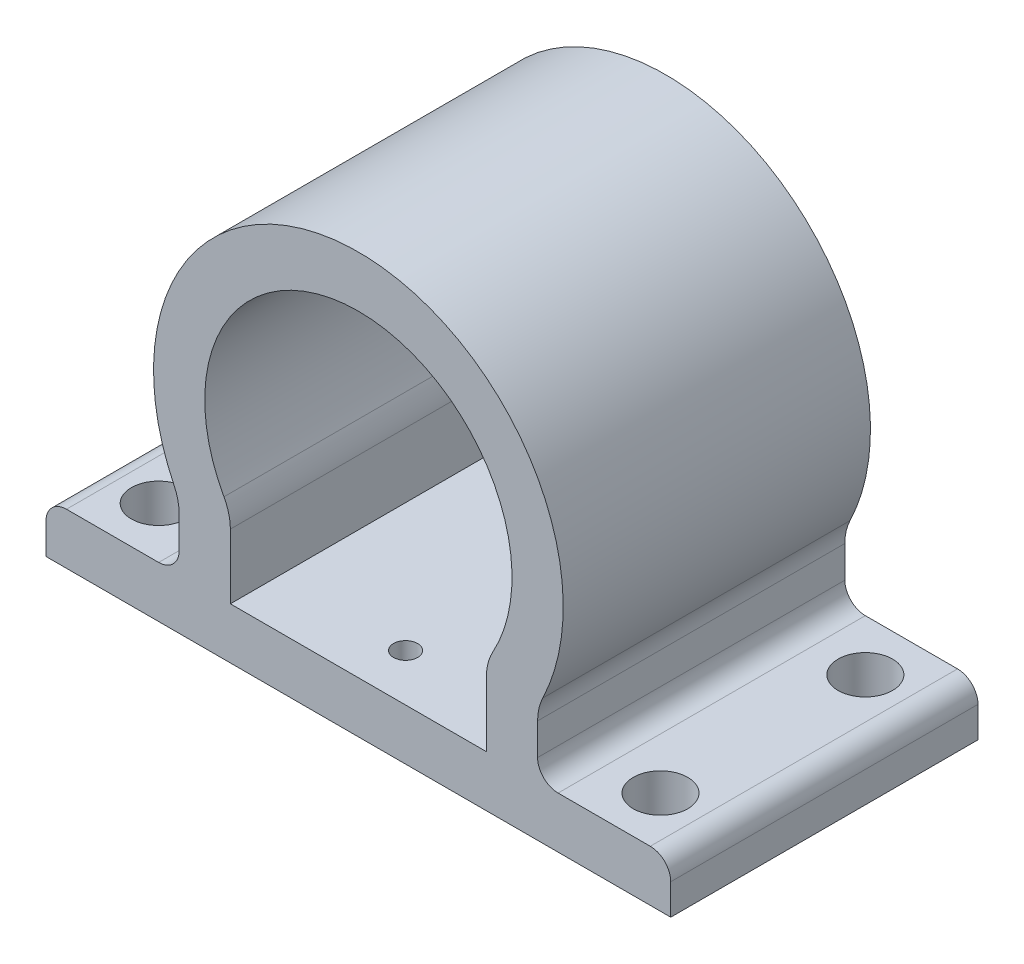
ISO-10303-21;
HEADER;
FILE_DESCRIPTION(('STEP AP214'),'2;1');
FILE_NAME('part.step','',(''),(''),'','','');
FILE_SCHEMA(('AUTOMOTIVE_DESIGN { 1 0 10303 214 1 1 1 1 }'));
ENDSEC;
DATA;
#1=APPLICATION_CONTEXT('core data for automotive mechanical design processes');
#2=APPLICATION_PROTOCOL_DEFINITION('international standard','automotive_design',2000,#1);
#3=PRODUCT_CONTEXT('',#1,'mechanical');
#4=PRODUCT('Part','Part','',(#3));
#5=PRODUCT_RELATED_PRODUCT_CATEGORY('part','',(#4));
#6=PRODUCT_DEFINITION_FORMATION('','',#4);
#7=PRODUCT_DEFINITION_CONTEXT('part definition',#1,'design');
#8=PRODUCT_DEFINITION('design','',#6,#7);
#9=PRODUCT_DEFINITION_SHAPE('','',#8);
#10=(LENGTH_UNIT() NAMED_UNIT(*) SI_UNIT(.MILLI.,.METRE.));
#11=(NAMED_UNIT(*) PLANE_ANGLE_UNIT() SI_UNIT($,.RADIAN.));
#12=(NAMED_UNIT(*) SI_UNIT($,.STERADIAN.) SOLID_ANGLE_UNIT());
#13=UNCERTAINTY_MEASURE_WITH_UNIT(LENGTH_MEASURE(1.E-05),#10,'distance_accuracy_value','');
#14=(GEOMETRIC_REPRESENTATION_CONTEXT(3) GLOBAL_UNCERTAINTY_ASSIGNED_CONTEXT((#13)) GLOBAL_UNIT_ASSIGNED_CONTEXT((#10,
#11,#12)) REPRESENTATION_CONTEXT('',''));
#15=CARTESIAN_POINT('',(0.,0.,0.));
#16=DIRECTION('',(0.,0.,1.));
#17=DIRECTION('',(1.,0.,0.));
#18=AXIS2_PLACEMENT_3D('',#15,#16,#17);
#19=CARTESIAN_POINT('',(0.,-20.32,32.2471478));
#20=DIRECTION('',(0.,-1.,0.));
#21=DIRECTION('',(0.,0.,-1.));
#22=AXIS2_PLACEMENT_3D('',#19,#20,#21);
#23=CYLINDRICAL_SURFACE('',#22,3.);
#24=CARTESIAN_POINT('',(0.,-26.67,32.2471478));
#25=DIRECTION('',(0.,-1.,0.));
#26=DIRECTION('',(0.,0.,-1.));
#27=AXIS2_PLACEMENT_3D('',#24,#25,#26);
#28=CIRCLE('',#27,3.);
#29=CARTESIAN_POINT('',(0.,-26.67,29.2471478));
#30=VERTEX_POINT('',#29);
#31=EDGE_CURVE('E231',#30,#30,#28,.T.);
#32=ORIENTED_EDGE('',*,*,#31,.T.);
#33=EDGE_LOOP('',(#32));
#34=FACE_BOUND('',#33,.T.);
#35=CARTESIAN_POINT('',(0.,-22.86,32.2471478));
#36=DIRECTION('',(0.,1.,0.));
#37=DIRECTION('',(0.,0.,1.));
#38=AXIS2_PLACEMENT_3D('',#35,#36,#37);
#39=CIRCLE('',#38,3.);
#40=CARTESIAN_POINT('',(0.,-22.86,35.2471478));
#41=VERTEX_POINT('',#40);
#42=EDGE_CURVE('E11',#41,#41,#39,.F.);
#43=ORIENTED_EDGE('',*,*,#42,.F.);
#44=EDGE_LOOP('',(#43));
#45=FACE_BOUND('',#44,.T.);
#46=ADVANCED_FACE('F39',(#34,#45),#23,.F.);
#47=CARTESIAN_POINT('',(0.,-20.32,13.2471478));
#48=DIRECTION('',(0.,-1.,0.));
#49=DIRECTION('',(0.,0.,-1.));
#50=AXIS2_PLACEMENT_3D('',#47,#48,#49);
#51=CYLINDRICAL_SURFACE('',#50,3.);
#52=CARTESIAN_POINT('',(0.,-26.67,13.2471478));
#53=DIRECTION('',(0.,-1.,0.));
#54=DIRECTION('',(0.,0.,-1.));
#55=AXIS2_PLACEMENT_3D('',#52,#53,#54);
#56=CIRCLE('',#55,3.);
#57=CARTESIAN_POINT('',(0.,-26.67,10.2471478));
#58=VERTEX_POINT('',#57);
#59=EDGE_CURVE('E230',#58,#58,#56,.T.);
#60=ORIENTED_EDGE('',*,*,#59,.T.);
#61=EDGE_LOOP('',(#60));
#62=FACE_BOUND('',#61,.T.);
#63=CARTESIAN_POINT('',(0.,-22.86,13.2471478));
#64=DIRECTION('',(0.,1.,0.));
#65=DIRECTION('',(0.,0.,1.));
#66=AXIS2_PLACEMENT_3D('',#63,#64,#65);
#67=CIRCLE('',#66,3.);
#68=CARTESIAN_POINT('',(0.,-22.86,16.2471478));
#69=VERTEX_POINT('',#68);
#70=EDGE_CURVE('E47',#69,#69,#67,.F.);
#71=ORIENTED_EDGE('',*,*,#70,.F.);
#72=EDGE_LOOP('',(#71));
#73=FACE_BOUND('',#72,.T.);
#74=ADVANCED_FACE('F362',(#62,#73),#51,.F.);
#75=CARTESIAN_POINT('',(-22.225,-26.67,38.1));
#76=DIRECTION('',(1.,0.,0.));
#77=DIRECTION('',(0.,0.,-1.));
#78=AXIS2_PLACEMENT_3D('',#75,#76,#77);
#79=PLANE('',#78);
#80=DIRECTION('',(0.,-1.,0.));
#81=VECTOR('',#80,1.);
#82=CARTESIAN_POINT('',(-22.225,-26.67,0.));
#83=LINE('',#82,#81);
#84=CARTESIAN_POINT('',(-22.225,-13.8395041457417,0.));
#85=VERTEX_POINT('',#84);
#86=CARTESIAN_POINT('',(-22.225,-17.78,0.));
#87=VERTEX_POINT('',#86);
#88=EDGE_CURVE('E272',#85,#87,#83,.T.);
#89=ORIENTED_EDGE('',*,*,#88,.T.);
#90=DIRECTION('',(0.,0.,-1.));
#91=VECTOR('',#90,1.);
#92=CARTESIAN_POINT('',(-22.225,-17.78,38.1));
#93=LINE('',#92,#91);
#94=CARTESIAN_POINT('',(-22.225,-17.78,38.1));
#95=VERTEX_POINT('',#94);
#96=EDGE_CURVE('E346',#87,#95,#93,.F.);
#97=ORIENTED_EDGE('',*,*,#96,.T.);
#98=DIRECTION('',(0.,-1.,0.));
#99=VECTOR('',#98,1.);
#100=CARTESIAN_POINT('',(-22.225,-26.67,38.1));
#101=LINE('',#100,#99);
#102=CARTESIAN_POINT('',(-22.225,-13.8395041457417,38.1));
#103=VERTEX_POINT('',#102);
#104=EDGE_CURVE('E188',#103,#95,#101,.T.);
#105=ORIENTED_EDGE('',*,*,#104,.F.);
#106=DIRECTION('',(0.,0.,1.));
#107=VECTOR('',#106,1.);
#108=CARTESIAN_POINT('',(-22.225,-13.8395041457417,0.));
#109=LINE('',#108,#107);
#110=EDGE_CURVE('E300',#103,#85,#109,.F.);
#111=ORIENTED_EDGE('',*,*,#110,.T.);
#112=EDGE_LOOP('',(#89,#97,#105,#111));
#113=FACE_BOUND('',#112,.T.);
#114=ADVANCED_FACE('F364',(#113),#79,.F.);
#115=CARTESIAN_POINT('',(0.,0.,38.1));
#116=DIRECTION('',(0.,0.,-1.));
#117=DIRECTION('',(-1.,0.,0.));
#118=AXIS2_PLACEMENT_3D('',#115,#116,#117);
#119=PLANE('',#118);
#120=DIRECTION('',(0.,1.,0.));
#121=VECTOR('',#120,1.);
#122=CARTESIAN_POINT('',(38.735,-20.32,38.1));
#123=LINE('',#122,#121);
#124=CARTESIAN_POINT('',(38.735,-26.67,38.1));
#125=VERTEX_POINT('',#124);
#126=CARTESIAN_POINT('',(38.735,-22.86,38.1));
#127=VERTEX_POINT('',#126);
#128=EDGE_CURVE('E180',#125,#127,#123,.T.);
#129=ORIENTED_EDGE('',*,*,#128,.T.);
#130=CARTESIAN_POINT('',(36.195,-22.86,38.1));
#131=DIRECTION('',(0.,0.,-1.));
#132=DIRECTION('',(-1.,0.,0.));
#133=AXIS2_PLACEMENT_3D('',#130,#131,#132);
#134=CIRCLE('',#133,2.54);
#135=CARTESIAN_POINT('',(36.195,-20.32,38.1));
#136=VERTEX_POINT('',#135);
#137=EDGE_CURVE('E336',#127,#136,#134,.F.);
#138=ORIENTED_EDGE('',*,*,#137,.T.);
#139=DIRECTION('',(-1.,0.,0.));
#140=VECTOR('',#139,1.);
#141=CARTESIAN_POINT('',(38.735,-20.32,38.1));
#142=LINE('',#141,#140);
#143=CARTESIAN_POINT('',(24.765,-20.32,38.1));
#144=VERTEX_POINT('',#143);
#145=EDGE_CURVE('E203',#136,#144,#142,.T.);
#146=ORIENTED_EDGE('',*,*,#145,.T.);
#147=CARTESIAN_POINT('',(24.765,-17.78,38.1));
#148=DIRECTION('',(0.,0.,-1.));
#149=DIRECTION('',(-1.,0.,0.));
#150=AXIS2_PLACEMENT_3D('',#147,#148,#149);
#151=CIRCLE('',#150,2.54);
#152=CARTESIAN_POINT('',(22.225,-17.78,38.1));
#153=VERTEX_POINT('',#152);
#154=EDGE_CURVE('E353',#144,#153,#151,.T.);
#155=ORIENTED_EDGE('',*,*,#154,.T.);
#156=DIRECTION('',(0.,1.,0.));
#157=VECTOR('',#156,1.);
#158=CARTESIAN_POINT('',(22.225,-26.67,38.1));
#159=LINE('',#158,#157);
#160=CARTESIAN_POINT('',(22.225,-13.8395041457417,38.1));
#161=VERTEX_POINT('',#160);
#162=EDGE_CURVE('E187',#153,#161,#159,.T.);
#163=ORIENTED_EDGE('',*,*,#162,.T.);
#164=CARTESIAN_POINT('',(28.575,-13.8395041457417,38.1));
#165=DIRECTION('',(0.,0.,-1.));
#166=DIRECTION('',(-1.,0.,0.));
#167=AXIS2_PLACEMENT_3D('',#164,#165,#166);
#168=CIRCLE('',#167,6.35);
#169=CARTESIAN_POINT('',(22.86,-11.0716033165933,38.1));
#170=VERTEX_POINT('',#169);
#171=EDGE_CURVE('E308',#161,#170,#168,.T.);
#172=ORIENTED_EDGE('',*,*,#171,.T.);
#173=CARTESIAN_POINT('',(0.,0.,38.1));
#174=DIRECTION('',(0.,0.,1.));
#175=DIRECTION('',(-1.,0.,0.));
#176=AXIS2_PLACEMENT_3D('',#173,#174,#175);
#177=CIRCLE('',#176,25.4);
#178=CARTESIAN_POINT('',(-22.86,-11.0716033165933,38.1));
#179=VERTEX_POINT('',#178);
#180=EDGE_CURVE('E263',#170,#179,#177,.T.);
#181=ORIENTED_EDGE('',*,*,#180,.T.);
#182=CARTESIAN_POINT('',(-28.575,-13.8395041457417,38.1));
#183=DIRECTION('',(0.,0.,-1.));
#184=DIRECTION('',(-1.,0.,0.));
#185=AXIS2_PLACEMENT_3D('',#182,#183,#184);
#186=CIRCLE('',#185,6.35);
#187=EDGE_CURVE('E312',#179,#103,#186,.T.);
#188=ORIENTED_EDGE('',*,*,#187,.T.);
#189=ORIENTED_EDGE('',*,*,#104,.T.);
#190=CARTESIAN_POINT('',(-24.765,-17.78,38.1));
#191=DIRECTION('',(0.,0.,-1.));
#192=DIRECTION('',(-1.,0.,0.));
#193=AXIS2_PLACEMENT_3D('',#190,#191,#192);
#194=CIRCLE('',#193,2.54);
#195=CARTESIAN_POINT('',(-24.765,-20.32,38.1));
#196=VERTEX_POINT('',#195);
#197=EDGE_CURVE('E60',#95,#196,#194,.T.);
#198=ORIENTED_EDGE('',*,*,#197,.T.);
#199=DIRECTION('',(1.,0.,0.));
#200=VECTOR('',#199,1.);
#201=CARTESIAN_POINT('',(-38.735,-20.32,38.1));
#202=LINE('',#201,#200);
#203=CARTESIAN_POINT('',(-36.195,-20.32,38.1));
#204=VERTEX_POINT('',#203);
#205=EDGE_CURVE('E228',#204,#196,#202,.T.);
#206=ORIENTED_EDGE('',*,*,#205,.F.);
#207=CARTESIAN_POINT('',(-36.195,-22.86,38.1));
#208=DIRECTION('',(0.,0.,-1.));
#209=DIRECTION('',(-1.,0.,0.));
#210=AXIS2_PLACEMENT_3D('',#207,#208,#209);
#211=CIRCLE('',#210,2.54);
#212=CARTESIAN_POINT('',(-38.735,-22.86,38.1));
#213=VERTEX_POINT('',#212);
#214=EDGE_CURVE('E54',#204,#213,#211,.F.);
#215=ORIENTED_EDGE('',*,*,#214,.T.);
#216=DIRECTION('',(0.,1.,0.));
#217=VECTOR('',#216,1.);
#218=CARTESIAN_POINT('',(-38.735,-20.32,38.1));
#219=LINE('',#218,#217);
#220=CARTESIAN_POINT('',(-38.735,-26.67,38.1));
#221=VERTEX_POINT('',#220);
#222=EDGE_CURVE('E182',#221,#213,#219,.T.);
#223=ORIENTED_EDGE('',*,*,#222,.F.);
#224=DIRECTION('',(1.,0.,0.));
#225=VECTOR('',#224,1.);
#226=CARTESIAN_POINT('',(-22.225,-26.67,38.1));
#227=LINE('',#226,#225);
#228=EDGE_CURVE('E176',#221,#125,#227,.T.);
#229=ORIENTED_EDGE('',*,*,#228,.T.);
#230=EDGE_LOOP('',(#129,#138,#146,#155,#163,#172,#181,#188,#189,#198,#206,#215,#223,#229));
#231=FACE_BOUND('',#230,.T.);
#232=CARTESIAN_POINT('',(0.,0.,38.1));
#233=DIRECTION('',(0.,0.,1.));
#234=DIRECTION('',(-1.,0.,0.));
#235=AXIS2_PLACEMENT_3D('',#232,#233,#234);
#236=CIRCLE('',#235,19.05);
#237=CARTESIAN_POINT('',(16.66875,-9.22254159315642,38.1));
#238=VERTEX_POINT('',#237);
#239=CARTESIAN_POINT('',(-16.66875,-9.22254159315642,38.1));
#240=VERTEX_POINT('',#239);
#241=EDGE_CURVE('E245',#238,#240,#236,.T.);
#242=ORIENTED_EDGE('',*,*,#241,.F.);
#243=CARTESIAN_POINT('',(22.225,-12.2967221242086,38.1));
#244=DIRECTION('',(0.,0.,-1.));
#245=DIRECTION('',(-1.,0.,0.));
#246=AXIS2_PLACEMENT_3D('',#243,#244,#245);
#247=CIRCLE('',#246,6.35);
#248=CARTESIAN_POINT('',(15.875,-12.2967221242086,38.1));
#249=VERTEX_POINT('',#248);
#250=EDGE_CURVE('E298',#238,#249,#247,.F.);
#251=ORIENTED_EDGE('',*,*,#250,.T.);
#252=DIRECTION('',(0.,1.,0.));
#253=VECTOR('',#252,1.);
#254=CARTESIAN_POINT('',(15.875,-20.32,38.1));
#255=LINE('',#254,#253);
#256=CARTESIAN_POINT('',(15.875,-20.32,38.1));
#257=VERTEX_POINT('',#256);
#258=EDGE_CURVE('E242',#257,#249,#255,.T.);
#259=ORIENTED_EDGE('',*,*,#258,.F.);
#260=DIRECTION('',(1.,0.,0.));
#261=VECTOR('',#260,1.);
#262=CARTESIAN_POINT('',(-15.875,-20.32,38.1));
#263=LINE('',#262,#261);
#264=CARTESIAN_POINT('',(-15.875,-20.32,38.1));
#265=VERTEX_POINT('',#264);
#266=EDGE_CURVE('E239',#265,#257,#263,.T.);
#267=ORIENTED_EDGE('',*,*,#266,.F.);
#268=DIRECTION('',(0.,-1.,0.));
#269=VECTOR('',#268,1.);
#270=CARTESIAN_POINT('',(-15.875,-20.32,38.1));
#271=LINE('',#270,#269);
#272=CARTESIAN_POINT('',(-15.875,-12.2967221242086,38.1));
#273=VERTEX_POINT('',#272);
#274=EDGE_CURVE('E237',#273,#265,#271,.T.);
#275=ORIENTED_EDGE('',*,*,#274,.F.);
#276=CARTESIAN_POINT('',(-22.225,-12.2967221242086,38.1));
#277=DIRECTION('',(0.,0.,-1.));
#278=DIRECTION('',(-1.,0.,0.));
#279=AXIS2_PLACEMENT_3D('',#276,#277,#278);
#280=CIRCLE('',#279,6.35);
#281=EDGE_CURVE('E296',#273,#240,#280,.F.);
#282=ORIENTED_EDGE('',*,*,#281,.T.);
#283=EDGE_LOOP('',(#242,#251,#259,#267,#275,#282));
#284=FACE_BOUND('',#283,.T.);
#285=ADVANCED_FACE('F178',(#231,#284),#119,.F.);
#286=CARTESIAN_POINT('',(0.,0.,0.));
#287=DIRECTION('',(0.,0.,-1.));
#288=DIRECTION('',(-1.,0.,0.));
#289=AXIS2_PLACEMENT_3D('',#286,#287,#288);
#290=PLANE('',#289);
#291=DIRECTION('',(-1.,0.,0.));
#292=VECTOR('',#291,1.);
#293=CARTESIAN_POINT('',(38.735,-20.32,0.));
#294=LINE('',#293,#292);
#295=CARTESIAN_POINT('',(36.195,-20.32,0.));
#296=VERTEX_POINT('',#295);
#297=CARTESIAN_POINT('',(24.765,-20.32,0.));
#298=VERTEX_POINT('',#297);
#299=EDGE_CURVE('E206',#296,#298,#294,.T.);
#300=ORIENTED_EDGE('',*,*,#299,.F.);
#301=CARTESIAN_POINT('',(36.195,-22.86,0.));
#302=DIRECTION('',(0.,0.,-1.));
#303=DIRECTION('',(-1.,0.,0.));
#304=AXIS2_PLACEMENT_3D('',#301,#302,#303);
#305=CIRCLE('',#304,2.54);
#306=CARTESIAN_POINT('',(38.735,-22.86,0.));
#307=VERTEX_POINT('',#306);
#308=EDGE_CURVE('E332',#296,#307,#305,.T.);
#309=ORIENTED_EDGE('',*,*,#308,.T.);
#310=DIRECTION('',(0.,-1.,0.));
#311=VECTOR('',#310,1.);
#312=CARTESIAN_POINT('',(38.735,-20.32,0.));
#313=LINE('',#312,#311);
#314=CARTESIAN_POINT('',(38.735,-26.67,0.));
#315=VERTEX_POINT('',#314);
#316=EDGE_CURVE('E197',#307,#315,#313,.T.);
#317=ORIENTED_EDGE('',*,*,#316,.T.);
#318=DIRECTION('',(1.,0.,0.));
#319=VECTOR('',#318,1.);
#320=CARTESIAN_POINT('',(-22.225,-26.67,0.));
#321=LINE('',#320,#319);
#322=CARTESIAN_POINT('',(-38.735,-26.67,0.));
#323=VERTEX_POINT('',#322);
#324=EDGE_CURVE('E202',#323,#315,#321,.T.);
#325=ORIENTED_EDGE('',*,*,#324,.F.);
#326=DIRECTION('',(0.,-1.,0.));
#327=VECTOR('',#326,1.);
#328=CARTESIAN_POINT('',(-38.735,-20.32,0.));
#329=LINE('',#328,#327);
#330=CARTESIAN_POINT('',(-38.735,-22.86,0.));
#331=VERTEX_POINT('',#330);
#332=EDGE_CURVE('E219',#331,#323,#329,.T.);
#333=ORIENTED_EDGE('',*,*,#332,.F.);
#334=CARTESIAN_POINT('',(-36.195,-22.86,0.));
#335=DIRECTION('',(0.,0.,-1.));
#336=DIRECTION('',(-1.,0.,0.));
#337=AXIS2_PLACEMENT_3D('',#334,#335,#336);
#338=CIRCLE('',#337,2.54);
#339=CARTESIAN_POINT('',(-36.195,-20.32,0.));
#340=VERTEX_POINT('',#339);
#341=EDGE_CURVE('E330',#331,#340,#338,.T.);
#342=ORIENTED_EDGE('',*,*,#341,.T.);
#343=DIRECTION('',(1.,0.,0.));
#344=VECTOR('',#343,1.);
#345=CARTESIAN_POINT('',(-38.735,-20.32,0.));
#346=LINE('',#345,#344);
#347=CARTESIAN_POINT('',(-24.765,-20.32,0.));
#348=VERTEX_POINT('',#347);
#349=EDGE_CURVE('E225',#340,#348,#346,.T.);
#350=ORIENTED_EDGE('',*,*,#349,.T.);
#351=CARTESIAN_POINT('',(-24.765,-17.78,0.));
#352=DIRECTION('',(0.,0.,-1.));
#353=DIRECTION('',(-1.,0.,0.));
#354=AXIS2_PLACEMENT_3D('',#351,#352,#353);
#355=CIRCLE('',#354,2.54);
#356=EDGE_CURVE('E355',#348,#87,#355,.F.);
#357=ORIENTED_EDGE('',*,*,#356,.T.);
#358=ORIENTED_EDGE('',*,*,#88,.F.);
#359=CARTESIAN_POINT('',(-28.575,-13.8395041457417,0.));
#360=DIRECTION('',(0.,0.,-1.));
#361=DIRECTION('',(-1.,0.,0.));
#362=AXIS2_PLACEMENT_3D('',#359,#360,#361);
#363=CIRCLE('',#362,6.35);
#364=CARTESIAN_POINT('',(-22.86,-11.0716033165933,0.));
#365=VERTEX_POINT('',#364);
#366=EDGE_CURVE('E310',#85,#365,#363,.F.);
#367=ORIENTED_EDGE('',*,*,#366,.T.);
#368=CARTESIAN_POINT('',(0.,0.,0.));
#369=DIRECTION('',(0.,0.,1.));
#370=DIRECTION('',(-1.,0.,0.));
#371=AXIS2_PLACEMENT_3D('',#368,#369,#370);
#372=CIRCLE('',#371,25.4);
#373=CARTESIAN_POINT('',(22.86,-11.0716033165933,0.));
#374=VERTEX_POINT('',#373);
#375=EDGE_CURVE('E262',#374,#365,#372,.T.);
#376=ORIENTED_EDGE('',*,*,#375,.F.);
#377=CARTESIAN_POINT('',(28.575,-13.8395041457417,0.));
#378=DIRECTION('',(0.,0.,-1.));
#379=DIRECTION('',(-1.,0.,0.));
#380=AXIS2_PLACEMENT_3D('',#377,#378,#379);
#381=CIRCLE('',#380,6.35);
#382=CARTESIAN_POINT('',(22.225,-13.8395041457417,0.));
#383=VERTEX_POINT('',#382);
#384=EDGE_CURVE('E305',#374,#383,#381,.F.);
#385=ORIENTED_EDGE('',*,*,#384,.T.);
#386=DIRECTION('',(0.,1.,0.));
#387=VECTOR('',#386,1.);
#388=CARTESIAN_POINT('',(22.225,-26.67,0.));
#389=LINE('',#388,#387);
#390=CARTESIAN_POINT('',(22.225,-17.78,0.));
#391=VERTEX_POINT('',#390);
#392=EDGE_CURVE('E266',#391,#383,#389,.T.);
#393=ORIENTED_EDGE('',*,*,#392,.F.);
#394=CARTESIAN_POINT('',(24.765,-17.78,0.));
#395=DIRECTION('',(0.,0.,-1.));
#396=DIRECTION('',(-1.,0.,0.));
#397=AXIS2_PLACEMENT_3D('',#394,#395,#396);
#398=CIRCLE('',#397,2.54);
#399=EDGE_CURVE('E351',#391,#298,#398,.F.);
#400=ORIENTED_EDGE('',*,*,#399,.T.);
#401=EDGE_LOOP('',(#300,#309,#317,#325,#333,#342,#350,#357,#358,#367,#376,#385,#393,#400));
#402=FACE_BOUND('',#401,.T.);
#403=DIRECTION('',(0.,1.,0.));
#404=VECTOR('',#403,1.);
#405=CARTESIAN_POINT('',(15.875,-20.32,0.));
#406=LINE('',#405,#404);
#407=CARTESIAN_POINT('',(15.875,-20.32,0.));
#408=VERTEX_POINT('',#407);
#409=CARTESIAN_POINT('',(15.875,-12.2967221242086,0.));
#410=VERTEX_POINT('',#409);
#411=EDGE_CURVE('E253',#408,#410,#406,.T.);
#412=ORIENTED_EDGE('',*,*,#411,.T.);
#413=CARTESIAN_POINT('',(22.225,-12.2967221242086,0.));
#414=DIRECTION('',(0.,0.,-1.));
#415=DIRECTION('',(-1.,0.,0.));
#416=AXIS2_PLACEMENT_3D('',#413,#414,#415);
#417=CIRCLE('',#416,6.35);
#418=CARTESIAN_POINT('',(16.66875,-9.22254159315642,0.));
#419=VERTEX_POINT('',#418);
#420=EDGE_CURVE('E289',#410,#419,#417,.T.);
#421=ORIENTED_EDGE('',*,*,#420,.T.);
#422=CARTESIAN_POINT('',(0.,0.,0.));
#423=DIRECTION('',(0.,0.,1.));
#424=DIRECTION('',(-1.,0.,0.));
#425=AXIS2_PLACEMENT_3D('',#422,#423,#424);
#426=CIRCLE('',#425,19.05);
#427=CARTESIAN_POINT('',(-16.66875,-9.22254159315642,0.));
#428=VERTEX_POINT('',#427);
#429=EDGE_CURVE('E240',#419,#428,#426,.T.);
#430=ORIENTED_EDGE('',*,*,#429,.T.);
#431=CARTESIAN_POINT('',(-22.225,-12.2967221242086,0.));
#432=DIRECTION('',(0.,0.,-1.));
#433=DIRECTION('',(-1.,0.,0.));
#434=AXIS2_PLACEMENT_3D('',#431,#432,#433);
#435=CIRCLE('',#434,6.35);
#436=CARTESIAN_POINT('',(-15.875,-12.2967221242086,0.));
#437=VERTEX_POINT('',#436);
#438=EDGE_CURVE('E287',#428,#437,#435,.T.);
#439=ORIENTED_EDGE('',*,*,#438,.T.);
#440=DIRECTION('',(0.,-1.,0.));
#441=VECTOR('',#440,1.);
#442=CARTESIAN_POINT('',(-15.875,-20.32,0.));
#443=LINE('',#442,#441);
#444=CARTESIAN_POINT('',(-15.875,-20.32,0.));
#445=VERTEX_POINT('',#444);
#446=EDGE_CURVE('E234',#437,#445,#443,.T.);
#447=ORIENTED_EDGE('',*,*,#446,.T.);
#448=DIRECTION('',(1.,0.,0.));
#449=VECTOR('',#448,1.);
#450=CARTESIAN_POINT('',(-15.875,-20.32,0.));
#451=LINE('',#450,#449);
#452=EDGE_CURVE('E250',#445,#408,#451,.T.);
#453=ORIENTED_EDGE('',*,*,#452,.T.);
#454=EDGE_LOOP('',(#412,#421,#430,#439,#447,#453));
#455=FACE_BOUND('',#454,.T.);
#456=ADVANCED_FACE('F398',(#402,#455),#290,.T.);
#457=CARTESIAN_POINT('',(0.,0.,38.1));
#458=DIRECTION('',(0.,0.,-1.));
#459=DIRECTION('',(-1.,0.,0.));
#460=AXIS2_PLACEMENT_3D('',#457,#458,#459);
#461=CYLINDRICAL_SURFACE('',#460,25.4);
#462=ORIENTED_EDGE('',*,*,#180,.F.);
#463=DIRECTION('',(0.,0.,-1.));
#464=VECTOR('',#463,1.);
#465=CARTESIAN_POINT('',(22.86,-11.0716033165933,38.1));
#466=LINE('',#465,#464);
#467=EDGE_CURVE('E278',#170,#374,#466,.T.);
#468=ORIENTED_EDGE('',*,*,#467,.T.);
#469=ORIENTED_EDGE('',*,*,#375,.T.);
#470=DIRECTION('',(0.,0.,-1.));
#471=VECTOR('',#470,1.);
#472=CARTESIAN_POINT('',(-22.86,-11.0716033165933,38.1));
#473=LINE('',#472,#471);
#474=EDGE_CURVE('E269',#365,#179,#473,.F.);
#475=ORIENTED_EDGE('',*,*,#474,.T.);
#476=EDGE_LOOP('',(#462,#468,#469,#475));
#477=FACE_BOUND('',#476,.T.);
#478=ADVANCED_FACE('F401',(#477),#461,.T.);
#479=CARTESIAN_POINT('',(-22.225,-26.67,38.1));
#480=DIRECTION('',(0.,1.,0.));
#481=DIRECTION('',(0.,0.,1.));
#482=AXIS2_PLACEMENT_3D('',#479,#480,#481);
#483=PLANE('',#482);
#484=CARTESIAN_POINT('',(31.115,-26.67,6.35));
#485=DIRECTION('',(0.,1.,0.));
#486=DIRECTION('',(0.,0.,-1.));
#487=AXIS2_PLACEMENT_3D('',#484,#485,#486);
#488=CIRCLE('',#487,3.3782);
#489=CARTESIAN_POINT('',(31.115,-26.67,2.9718));
#490=VERTEX_POINT('',#489);
#491=EDGE_CURVE('E323',#490,#490,#488,.T.);
#492=ORIENTED_EDGE('',*,*,#491,.T.);
#493=EDGE_LOOP('',(#492));
#494=FACE_BOUND('',#493,.T.);
#495=CARTESIAN_POINT('',(31.115,-26.67,31.75));
#496=DIRECTION('',(0.,1.,0.));
#497=DIRECTION('',(0.,0.,-1.));
#498=AXIS2_PLACEMENT_3D('',#495,#496,#497);
#499=CIRCLE('',#498,3.3782);
#500=CARTESIAN_POINT('',(31.115,-26.67,28.3718));
#501=VERTEX_POINT('',#500);
#502=EDGE_CURVE('E456',#501,#501,#499,.T.);
#503=ORIENTED_EDGE('',*,*,#502,.T.);
#504=EDGE_LOOP('',(#503));
#505=FACE_BOUND('',#504,.T.);
#506=CARTESIAN_POINT('',(-31.115,-26.67,6.35));
#507=DIRECTION('',(0.,-1.,0.));
#508=DIRECTION('',(0.,0.,-1.));
#509=AXIS2_PLACEMENT_3D('',#506,#507,#508);
#510=CIRCLE('',#509,3.3782);
#511=CARTESIAN_POINT('',(-31.115,-26.67,2.9718));
#512=VERTEX_POINT('',#511);
#513=EDGE_CURVE('E213',#512,#512,#510,.T.);
#514=ORIENTED_EDGE('',*,*,#513,.F.);
#515=EDGE_LOOP('',(#514));
#516=FACE_BOUND('',#515,.T.);
#517=CARTESIAN_POINT('',(-31.115,-26.67,31.75));
#518=DIRECTION('',(0.,-1.,0.));
#519=DIRECTION('',(0.,0.,-1.));
#520=AXIS2_PLACEMENT_3D('',#517,#518,#519);
#521=CIRCLE('',#520,3.3782);
#522=CARTESIAN_POINT('',(-31.115,-26.67,28.3718));
#523=VERTEX_POINT('',#522);
#524=EDGE_CURVE('E212',#523,#523,#521,.T.);
#525=ORIENTED_EDGE('',*,*,#524,.F.);
#526=EDGE_LOOP('',(#525));
#527=FACE_BOUND('',#526,.T.);
#528=ORIENTED_EDGE('',*,*,#31,.F.);
#529=EDGE_LOOP('',(#528));
#530=FACE_BOUND('',#529,.T.);
#531=ORIENTED_EDGE('',*,*,#59,.F.);
#532=EDGE_LOOP('',(#531));
#533=FACE_BOUND('',#532,.T.);
#534=ORIENTED_EDGE('',*,*,#324,.T.);
#535=DIRECTION('',(0.,0.,1.));
#536=VECTOR('',#535,1.);
#537=CARTESIAN_POINT('',(38.735,-26.67,0.));
#538=LINE('',#537,#536);
#539=EDGE_CURVE('E194',#315,#125,#538,.T.);
#540=ORIENTED_EDGE('',*,*,#539,.T.);
#541=ORIENTED_EDGE('',*,*,#228,.F.);
#542=DIRECTION('',(0.,0.,1.));
#543=VECTOR('',#542,1.);
#544=CARTESIAN_POINT('',(-38.735,-26.67,0.));
#545=LINE('',#544,#543);
#546=EDGE_CURVE('E221',#323,#221,#545,.T.);
#547=ORIENTED_EDGE('',*,*,#546,.F.);
#548=EDGE_LOOP('',(#534,#540,#541,#547));
#549=FACE_BOUND('',#548,.T.);
#550=ADVANCED_FACE('F200',(#494,#505,#516,#527,#530,#533,#549),#483,.F.);
#551=CARTESIAN_POINT('',(22.225,-26.67,38.1));
#552=DIRECTION('',(-1.,0.,0.));
#553=DIRECTION('',(0.,0.,1.));
#554=AXIS2_PLACEMENT_3D('',#551,#552,#553);
#555=PLANE('',#554);
#556=ORIENTED_EDGE('',*,*,#162,.F.);
#557=DIRECTION('',(0.,0.,-1.));
#558=VECTOR('',#557,1.);
#559=CARTESIAN_POINT('',(22.225,-17.78,38.1));
#560=LINE('',#559,#558);
#561=EDGE_CURVE('E338',#153,#391,#560,.T.);
#562=ORIENTED_EDGE('',*,*,#561,.T.);
#563=ORIENTED_EDGE('',*,*,#392,.T.);
#564=DIRECTION('',(0.,0.,1.));
#565=VECTOR('',#564,1.);
#566=CARTESIAN_POINT('',(22.225,-13.8395041457417,38.1));
#567=LINE('',#566,#565);
#568=EDGE_CURVE('E281',#383,#161,#567,.T.);
#569=ORIENTED_EDGE('',*,*,#568,.T.);
#570=EDGE_LOOP('',(#556,#562,#563,#569));
#571=FACE_BOUND('',#570,.T.);
#572=ADVANCED_FACE('F394',(#571),#555,.F.);
#573=CARTESIAN_POINT('',(-15.875,-20.32,38.1));
#574=DIRECTION('',(1.,0.,0.));
#575=DIRECTION('',(0.,0.,-1.));
#576=AXIS2_PLACEMENT_3D('',#573,#574,#575);
#577=PLANE('',#576);
#578=ORIENTED_EDGE('',*,*,#446,.F.);
#579=DIRECTION('',(0.,0.,-1.));
#580=VECTOR('',#579,1.);
#581=CARTESIAN_POINT('',(-15.875,-12.2967221242086,38.1));
#582=LINE('',#581,#580);
#583=EDGE_CURVE('E303',#437,#273,#582,.F.);
#584=ORIENTED_EDGE('',*,*,#583,.T.);
#585=ORIENTED_EDGE('',*,*,#274,.T.);
#586=DIRECTION('',(0.,0.,-1.));
#587=VECTOR('',#586,1.);
#588=CARTESIAN_POINT('',(-15.875,-20.32,38.1));
#589=LINE('',#588,#587);
#590=EDGE_CURVE('E259',#265,#445,#589,.T.);
#591=ORIENTED_EDGE('',*,*,#590,.T.);
#592=EDGE_LOOP('',(#578,#584,#585,#591));
#593=FACE_BOUND('',#592,.T.);
#594=ADVANCED_FACE('F390',(#593),#577,.T.);
#595=CARTESIAN_POINT('',(-15.875,-20.32,38.1));
#596=DIRECTION('',(0.,1.,0.));
#597=DIRECTION('',(0.,0.,1.));
#598=AXIS2_PLACEMENT_3D('',#595,#596,#597);
#599=PLANE('',#598);
#600=ORIENTED_EDGE('',*,*,#452,.F.);
#601=ORIENTED_EDGE('',*,*,#590,.F.);
#602=ORIENTED_EDGE('',*,*,#266,.T.);
#603=DIRECTION('',(0.,0.,-1.));
#604=VECTOR('',#603,1.);
#605=CARTESIAN_POINT('',(15.875,-20.32,38.1));
#606=LINE('',#605,#604);
#607=EDGE_CURVE('E248',#257,#408,#606,.T.);
#608=ORIENTED_EDGE('',*,*,#607,.T.);
#609=EDGE_LOOP('',(#600,#601,#602,#608));
#610=FACE_BOUND('',#609,.T.);
#611=CARTESIAN_POINT('',(0.,-20.32,13.2471478));
#612=DIRECTION('',(0.,1.,0.));
#613=DIRECTION('',(0.,0.,1.));
#614=AXIS2_PLACEMENT_3D('',#611,#612,#613);
#615=CIRCLE('',#614,1.5);
#616=CARTESIAN_POINT('',(0.,-20.32,14.7471478));
#617=VERTEX_POINT('',#616);
#618=EDGE_CURVE('E462',#617,#617,#615,.T.);
#619=ORIENTED_EDGE('',*,*,#618,.F.);
#620=EDGE_LOOP('',(#619));
#621=FACE_BOUND('',#620,.T.);
#622=CARTESIAN_POINT('',(0.,-20.32,32.2471478));
#623=DIRECTION('',(0.,1.,0.));
#624=DIRECTION('',(0.,0.,1.));
#625=AXIS2_PLACEMENT_3D('',#622,#623,#624);
#626=CIRCLE('',#625,1.5);
#627=CARTESIAN_POINT('',(0.,-20.32,33.7471478));
#628=VERTEX_POINT('',#627);
#629=EDGE_CURVE('E465',#628,#628,#626,.T.);
#630=ORIENTED_EDGE('',*,*,#629,.F.);
#631=EDGE_LOOP('',(#630));
#632=FACE_BOUND('',#631,.T.);
#633=ADVANCED_FACE('F386',(#610,#621,#632),#599,.T.);
#634=CARTESIAN_POINT('',(15.875,-20.32,38.1));
#635=DIRECTION('',(-1.,0.,0.));
#636=DIRECTION('',(0.,0.,1.));
#637=AXIS2_PLACEMENT_3D('',#634,#635,#636);
#638=PLANE('',#637);
#639=ORIENTED_EDGE('',*,*,#258,.T.);
#640=DIRECTION('',(0.,0.,-1.));
#641=VECTOR('',#640,1.);
#642=CARTESIAN_POINT('',(15.875,-12.2967221242086,38.1));
#643=LINE('',#642,#641);
#644=EDGE_CURVE('E284',#249,#410,#643,.T.);
#645=ORIENTED_EDGE('',*,*,#644,.T.);
#646=ORIENTED_EDGE('',*,*,#411,.F.);
#647=ORIENTED_EDGE('',*,*,#607,.F.);
#648=EDGE_LOOP('',(#639,#645,#646,#647));
#649=FACE_BOUND('',#648,.T.);
#650=ADVANCED_FACE('F382',(#649),#638,.T.);
#651=CARTESIAN_POINT('',(0.,0.,38.1));
#652=DIRECTION('',(0.,0.,-1.));
#653=DIRECTION('',(-1.,0.,0.));
#654=AXIS2_PLACEMENT_3D('',#651,#652,#653);
#655=CYLINDRICAL_SURFACE('',#654,19.05);
#656=ORIENTED_EDGE('',*,*,#429,.F.);
#657=DIRECTION('',(0.,0.,-1.));
#658=VECTOR('',#657,1.);
#659=CARTESIAN_POINT('',(16.66875,-9.22254159315642,38.1));
#660=LINE('',#659,#658);
#661=EDGE_CURVE('E294',#419,#238,#660,.F.);
#662=ORIENTED_EDGE('',*,*,#661,.T.);
#663=ORIENTED_EDGE('',*,*,#241,.T.);
#664=DIRECTION('',(0.,0.,-1.));
#665=VECTOR('',#664,1.);
#666=CARTESIAN_POINT('',(-16.66875,-9.22254159315642,38.1));
#667=LINE('',#666,#665);
#668=EDGE_CURVE('E291',#240,#428,#667,.T.);
#669=ORIENTED_EDGE('',*,*,#668,.T.);
#670=EDGE_LOOP('',(#656,#662,#663,#669));
#671=FACE_BOUND('',#670,.T.);
#672=ADVANCED_FACE('F378',(#671),#655,.F.);
#673=CARTESIAN_POINT('',(28.575,-13.8395041457417,38.1));
#674=DIRECTION('',(0.,0.,-1.));
#675=DIRECTION('',(-1.,0.,0.));
#676=AXIS2_PLACEMENT_3D('',#673,#674,#675);
#677=CYLINDRICAL_SURFACE('',#676,6.35);
#678=ORIENTED_EDGE('',*,*,#171,.F.);
#679=ORIENTED_EDGE('',*,*,#568,.F.);
#680=ORIENTED_EDGE('',*,*,#384,.F.);
#681=ORIENTED_EDGE('',*,*,#467,.F.);
#682=EDGE_LOOP('',(#678,#679,#680,#681));
#683=FACE_BOUND('',#682,.T.);
#684=ADVANCED_FACE('F381',(#683),#677,.F.);
#685=CARTESIAN_POINT('',(22.225,-12.2967221242086,38.1));
#686=DIRECTION('',(0.,0.,-1.));
#687=DIRECTION('',(-1.,0.,0.));
#688=AXIS2_PLACEMENT_3D('',#685,#686,#687);
#689=CYLINDRICAL_SURFACE('',#688,6.35);
#690=ORIENTED_EDGE('',*,*,#250,.F.);
#691=ORIENTED_EDGE('',*,*,#661,.F.);
#692=ORIENTED_EDGE('',*,*,#420,.F.);
#693=ORIENTED_EDGE('',*,*,#644,.F.);
#694=EDGE_LOOP('',(#690,#691,#692,#693));
#695=FACE_BOUND('',#694,.T.);
#696=ADVANCED_FACE('F414',(#695),#689,.T.);
#697=CARTESIAN_POINT('',(-28.575,-13.8395041457417,38.1));
#698=DIRECTION('',(0.,0.,-1.));
#699=DIRECTION('',(-1.,0.,0.));
#700=AXIS2_PLACEMENT_3D('',#697,#698,#699);
#701=CYLINDRICAL_SURFACE('',#700,6.35);
#702=ORIENTED_EDGE('',*,*,#187,.F.);
#703=ORIENTED_EDGE('',*,*,#474,.F.);
#704=ORIENTED_EDGE('',*,*,#366,.F.);
#705=ORIENTED_EDGE('',*,*,#110,.F.);
#706=EDGE_LOOP('',(#702,#703,#704,#705));
#707=FACE_BOUND('',#706,.T.);
#708=ADVANCED_FACE('F418',(#707),#701,.F.);
#709=CARTESIAN_POINT('',(-22.225,-12.2967221242086,38.1));
#710=DIRECTION('',(0.,0.,-1.));
#711=DIRECTION('',(-1.,0.,0.));
#712=AXIS2_PLACEMENT_3D('',#709,#710,#711);
#713=CYLINDRICAL_SURFACE('',#712,6.35);
#714=ORIENTED_EDGE('',*,*,#281,.F.);
#715=ORIENTED_EDGE('',*,*,#583,.F.);
#716=ORIENTED_EDGE('',*,*,#438,.F.);
#717=ORIENTED_EDGE('',*,*,#668,.F.);
#718=EDGE_LOOP('',(#714,#715,#716,#717));
#719=FACE_BOUND('',#718,.T.);
#720=ADVANCED_FACE('F422',(#719),#713,.T.);
#721=CARTESIAN_POINT('',(-38.735,-20.32,0.));
#722=DIRECTION('',(0.,-1.,0.));
#723=DIRECTION('',(0.,0.,-1.));
#724=AXIS2_PLACEMENT_3D('',#721,#722,#723);
#725=PLANE('',#724);
#726=CARTESIAN_POINT('',(-31.115,-20.32,6.35));
#727=DIRECTION('',(0.,-1.,0.));
#728=DIRECTION('',(0.,0.,-1.));
#729=AXIS2_PLACEMENT_3D('',#726,#727,#728);
#730=CIRCLE('',#729,3.3782);
#731=CARTESIAN_POINT('',(-31.115,-20.32,2.9718));
#732=VERTEX_POINT('',#731);
#733=EDGE_CURVE('E222',#732,#732,#730,.T.);
#734=ORIENTED_EDGE('',*,*,#733,.T.);
#735=EDGE_LOOP('',(#734));
#736=FACE_BOUND('',#735,.T.);
#737=CARTESIAN_POINT('',(-31.115,-20.32,31.75));
#738=DIRECTION('',(0.,-1.,0.));
#739=DIRECTION('',(0.,0.,-1.));
#740=AXIS2_PLACEMENT_3D('',#737,#738,#739);
#741=CIRCLE('',#740,3.3782);
#742=CARTESIAN_POINT('',(-31.115,-20.32,28.3718));
#743=VERTEX_POINT('',#742);
#744=EDGE_CURVE('E216',#743,#743,#741,.T.);
#745=ORIENTED_EDGE('',*,*,#744,.T.);
#746=EDGE_LOOP('',(#745));
#747=FACE_BOUND('',#746,.T.);
#748=ORIENTED_EDGE('',*,*,#205,.T.);
#749=DIRECTION('',(0.,0.,-1.));
#750=VECTOR('',#749,1.);
#751=CARTESIAN_POINT('',(-24.765,-20.32,0.));
#752=LINE('',#751,#750);
#753=EDGE_CURVE('E343',#196,#348,#752,.T.);
#754=ORIENTED_EDGE('',*,*,#753,.T.);
#755=ORIENTED_EDGE('',*,*,#349,.F.);
#756=DIRECTION('',(0.,0.,-1.));
#757=VECTOR('',#756,1.);
#758=CARTESIAN_POINT('',(-36.195,-20.32,38.1));
#759=LINE('',#758,#757);
#760=EDGE_CURVE('E341',#340,#204,#759,.F.);
#761=ORIENTED_EDGE('',*,*,#760,.T.);
#762=EDGE_LOOP('',(#748,#754,#755,#761));
#763=FACE_BOUND('',#762,.T.);
#764=ADVANCED_FACE('F426',(#736,#747,#763),#725,.F.);
#765=CARTESIAN_POINT('',(-38.735,0.,0.));
#766=DIRECTION('',(-1.,0.,0.));
#767=DIRECTION('',(0.,0.,1.));
#768=AXIS2_PLACEMENT_3D('',#765,#766,#767);
#769=PLANE('',#768);
#770=ORIENTED_EDGE('',*,*,#222,.T.);
#771=DIRECTION('',(0.,0.,-1.));
#772=VECTOR('',#771,1.);
#773=CARTESIAN_POINT('',(-38.735,-22.86,0.));
#774=LINE('',#773,#772);
#775=EDGE_CURVE('E348',#213,#331,#774,.T.);
#776=ORIENTED_EDGE('',*,*,#775,.T.);
#777=ORIENTED_EDGE('',*,*,#332,.T.);
#778=ORIENTED_EDGE('',*,*,#546,.T.);
#779=EDGE_LOOP('',(#770,#776,#777,#778));
#780=FACE_BOUND('',#779,.T.);
#781=ADVANCED_FACE('F454',(#780),#769,.T.);
#782=CARTESIAN_POINT('',(-31.115,25.4,31.75));
#783=DIRECTION('',(0.,-1.,0.));
#784=DIRECTION('',(0.,0.,-1.));
#785=AXIS2_PLACEMENT_3D('',#782,#783,#784);
#786=CYLINDRICAL_SURFACE('',#785,3.3782);
#787=ORIENTED_EDGE('',*,*,#524,.T.);
#788=EDGE_LOOP('',(#787));
#789=FACE_BOUND('',#788,.T.);
#790=ORIENTED_EDGE('',*,*,#744,.F.);
#791=EDGE_LOOP('',(#790));
#792=FACE_BOUND('',#791,.T.);
#793=ADVANCED_FACE('F510',(#789,#792),#786,.F.);
#794=CARTESIAN_POINT('',(-31.115,25.4,6.35));
#795=DIRECTION('',(0.,-1.,0.));
#796=DIRECTION('',(0.,0.,-1.));
#797=AXIS2_PLACEMENT_3D('',#794,#795,#796);
#798=CYLINDRICAL_SURFACE('',#797,3.3782);
#799=ORIENTED_EDGE('',*,*,#513,.T.);
#800=EDGE_LOOP('',(#799));
#801=FACE_BOUND('',#800,.T.);
#802=ORIENTED_EDGE('',*,*,#733,.F.);
#803=EDGE_LOOP('',(#802));
#804=FACE_BOUND('',#803,.T.);
#805=ADVANCED_FACE('F506',(#801,#804),#798,.F.);
#806=CARTESIAN_POINT('',(38.735,-20.32,0.));
#807=DIRECTION('',(0.,1.,0.));
#808=DIRECTION('',(0.,0.,1.));
#809=AXIS2_PLACEMENT_3D('',#806,#807,#808);
#810=PLANE('',#809);
#811=CARTESIAN_POINT('',(31.115,-20.32,6.35));
#812=DIRECTION('',(0.,1.,0.));
#813=DIRECTION('',(0.,0.,1.));
#814=AXIS2_PLACEMENT_3D('',#811,#812,#813);
#815=CIRCLE('',#814,3.3782);
#816=CARTESIAN_POINT('',(31.115,-20.32,9.7282));
#817=VERTEX_POINT('',#816);
#818=EDGE_CURVE('E322',#817,#817,#815,.F.);
#819=ORIENTED_EDGE('',*,*,#818,.T.);
#820=EDGE_LOOP('',(#819));
#821=FACE_BOUND('',#820,.T.);
#822=CARTESIAN_POINT('',(31.115,-20.32,31.75));
#823=DIRECTION('',(0.,1.,0.));
#824=DIRECTION('',(0.,0.,1.));
#825=AXIS2_PLACEMENT_3D('',#822,#823,#824);
#826=CIRCLE('',#825,3.3782);
#827=CARTESIAN_POINT('',(31.115,-20.32,35.1282));
#828=VERTEX_POINT('',#827);
#829=EDGE_CURVE('E319',#828,#828,#826,.F.);
#830=ORIENTED_EDGE('',*,*,#829,.T.);
#831=EDGE_LOOP('',(#830));
#832=FACE_BOUND('',#831,.T.);
#833=ORIENTED_EDGE('',*,*,#145,.F.);
#834=DIRECTION('',(0.,0.,-1.));
#835=VECTOR('',#834,1.);
#836=CARTESIAN_POINT('',(36.195,-20.32,0.));
#837=LINE('',#836,#835);
#838=EDGE_CURVE('E327',#136,#296,#837,.T.);
#839=ORIENTED_EDGE('',*,*,#838,.T.);
#840=ORIENTED_EDGE('',*,*,#299,.T.);
#841=DIRECTION('',(0.,0.,-1.));
#842=VECTOR('',#841,1.);
#843=CARTESIAN_POINT('',(24.765,-20.32,0.));
#844=LINE('',#843,#842);
#845=EDGE_CURVE('E314',#298,#144,#844,.F.);
#846=ORIENTED_EDGE('',*,*,#845,.T.);
#847=EDGE_LOOP('',(#833,#839,#840,#846));
#848=FACE_BOUND('',#847,.T.);
#849=ADVANCED_FACE('F503',(#821,#832,#848),#810,.T.);
#850=CARTESIAN_POINT('',(38.735,0.,0.));
#851=DIRECTION('',(1.,0.,0.));
#852=DIRECTION('',(0.,0.,1.));
#853=AXIS2_PLACEMENT_3D('',#850,#851,#852);
#854=PLANE('',#853);
#855=ORIENTED_EDGE('',*,*,#316,.F.);
#856=DIRECTION('',(0.,0.,-1.));
#857=VECTOR('',#856,1.);
#858=CARTESIAN_POINT('',(38.735,-22.86,0.));
#859=LINE('',#858,#857);
#860=EDGE_CURVE('E196',#307,#127,#859,.F.);
#861=ORIENTED_EDGE('',*,*,#860,.T.);
#862=ORIENTED_EDGE('',*,*,#128,.F.);
#863=ORIENTED_EDGE('',*,*,#539,.F.);
#864=EDGE_LOOP('',(#855,#861,#862,#863));
#865=FACE_BOUND('',#864,.T.);
#866=ADVANCED_FACE('F193',(#865),#854,.T.);
#867=CARTESIAN_POINT('',(31.115,25.4,31.75));
#868=DIRECTION('',(0.,-1.,0.));
#869=DIRECTION('',(0.,0.,-1.));
#870=AXIS2_PLACEMENT_3D('',#867,#868,#869);
#871=CYLINDRICAL_SURFACE('',#870,3.3782);
#872=ORIENTED_EDGE('',*,*,#829,.F.);
#873=EDGE_LOOP('',(#872));
#874=FACE_BOUND('',#873,.T.);
#875=ORIENTED_EDGE('',*,*,#502,.F.);
#876=EDGE_LOOP('',(#875));
#877=FACE_BOUND('',#876,.T.);
#878=ADVANCED_FACE('F496',(#874,#877),#871,.F.);
#879=CARTESIAN_POINT('',(31.115,25.4,6.35));
#880=DIRECTION('',(0.,-1.,0.));
#881=DIRECTION('',(0.,0.,-1.));
#882=AXIS2_PLACEMENT_3D('',#879,#880,#881);
#883=CYLINDRICAL_SURFACE('',#882,3.3782);
#884=ORIENTED_EDGE('',*,*,#818,.F.);
#885=EDGE_LOOP('',(#884));
#886=FACE_BOUND('',#885,.T.);
#887=ORIENTED_EDGE('',*,*,#491,.F.);
#888=EDGE_LOOP('',(#887));
#889=FACE_BOUND('',#888,.T.);
#890=ADVANCED_FACE('F432',(#886,#889),#883,.F.);
#891=CARTESIAN_POINT('',(36.195,-22.86,0.));
#892=DIRECTION('',(0.,0.,-1.));
#893=DIRECTION('',(-1.,0.,0.));
#894=AXIS2_PLACEMENT_3D('',#891,#892,#893);
#895=CYLINDRICAL_SURFACE('',#894,2.54);
#896=ORIENTED_EDGE('',*,*,#137,.F.);
#897=ORIENTED_EDGE('',*,*,#860,.F.);
#898=ORIENTED_EDGE('',*,*,#308,.F.);
#899=ORIENTED_EDGE('',*,*,#838,.F.);
#900=EDGE_LOOP('',(#896,#897,#898,#899));
#901=FACE_BOUND('',#900,.T.);
#902=ADVANCED_FACE('F428',(#901),#895,.T.);
#903=CARTESIAN_POINT('',(24.765,-17.78,38.1));
#904=DIRECTION('',(0.,0.,-1.));
#905=DIRECTION('',(-1.,0.,0.));
#906=AXIS2_PLACEMENT_3D('',#903,#904,#905);
#907=CYLINDRICAL_SURFACE('',#906,2.54);
#908=ORIENTED_EDGE('',*,*,#154,.F.);
#909=ORIENTED_EDGE('',*,*,#845,.F.);
#910=ORIENTED_EDGE('',*,*,#399,.F.);
#911=ORIENTED_EDGE('',*,*,#561,.F.);
#912=EDGE_LOOP('',(#908,#909,#910,#911));
#913=FACE_BOUND('',#912,.T.);
#914=ADVANCED_FACE('F431',(#913),#907,.F.);
#915=CARTESIAN_POINT('',(-24.765,-17.78,0.));
#916=DIRECTION('',(0.,0.,1.));
#917=DIRECTION('',(1.,0.,0.));
#918=AXIS2_PLACEMENT_3D('',#915,#916,#917);
#919=CYLINDRICAL_SURFACE('',#918,2.54);
#920=ORIENTED_EDGE('',*,*,#197,.F.);
#921=ORIENTED_EDGE('',*,*,#96,.F.);
#922=ORIENTED_EDGE('',*,*,#356,.F.);
#923=ORIENTED_EDGE('',*,*,#753,.F.);
#924=EDGE_LOOP('',(#920,#921,#922,#923));
#925=FACE_BOUND('',#924,.T.);
#926=ADVANCED_FACE('F435',(#925),#919,.F.);
#927=CARTESIAN_POINT('',(-36.195,-22.86,0.));
#928=DIRECTION('',(0.,0.,1.));
#929=DIRECTION('',(1.,0.,0.));
#930=AXIS2_PLACEMENT_3D('',#927,#928,#929);
#931=CYLINDRICAL_SURFACE('',#930,2.54);
#932=ORIENTED_EDGE('',*,*,#214,.F.);
#933=ORIENTED_EDGE('',*,*,#760,.F.);
#934=ORIENTED_EDGE('',*,*,#341,.F.);
#935=ORIENTED_EDGE('',*,*,#775,.F.);
#936=EDGE_LOOP('',(#932,#933,#934,#935));
#937=FACE_BOUND('',#936,.T.);
#938=ADVANCED_FACE('F41',(#937),#931,.T.);
#939=CARTESIAN_POINT('',(0.,-22.86,13.2471478));
#940=DIRECTION('',(0.,1.,0.));
#941=DIRECTION('',(0.,0.,1.));
#942=AXIS2_PLACEMENT_3D('',#939,#940,#941);
#943=PLANE('',#942);
#944=CARTESIAN_POINT('',(0.,-22.86,13.2471478));
#945=DIRECTION('',(0.,1.,0.));
#946=DIRECTION('',(0.,0.,1.));
#947=AXIS2_PLACEMENT_3D('',#944,#945,#946);
#948=CIRCLE('',#947,1.5);
#949=CARTESIAN_POINT('',(0.,-22.86,14.7471478));
#950=VERTEX_POINT('',#949);
#951=EDGE_CURVE('E459',#950,#950,#948,.T.);
#952=ORIENTED_EDGE('',*,*,#951,.T.);
#953=EDGE_LOOP('',(#952));
#954=FACE_BOUND('',#953,.T.);
#955=ORIENTED_EDGE('',*,*,#70,.T.);
#956=EDGE_LOOP('',(#955));
#957=FACE_BOUND('',#956,.T.);
#958=ADVANCED_FACE('F360',(#954,#957),#943,.F.);
#959=CARTESIAN_POINT('',(0.,-22.86,13.2471478));
#960=DIRECTION('',(0.,1.,0.));
#961=DIRECTION('',(0.,0.,1.));
#962=AXIS2_PLACEMENT_3D('',#959,#960,#961);
#963=CYLINDRICAL_SURFACE('',#962,1.5);
#964=ORIENTED_EDGE('',*,*,#951,.F.);
#965=EDGE_LOOP('',(#964));
#966=FACE_BOUND('',#965,.T.);
#967=ORIENTED_EDGE('',*,*,#618,.T.);
#968=EDGE_LOOP('',(#967));
#969=FACE_BOUND('',#968,.T.);
#970=ADVANCED_FACE('F483',(#966,#969),#963,.F.);
#971=CARTESIAN_POINT('',(0.,-22.86,32.2471478));
#972=DIRECTION('',(0.,1.,0.));
#973=DIRECTION('',(0.,0.,1.));
#974=AXIS2_PLACEMENT_3D('',#971,#972,#973);
#975=PLANE('',#974);
#976=CARTESIAN_POINT('',(0.,-22.86,32.2471478));
#977=DIRECTION('',(0.,1.,0.));
#978=DIRECTION('',(0.,0.,1.));
#979=AXIS2_PLACEMENT_3D('',#976,#977,#978);
#980=CIRCLE('',#979,1.5);
#981=CARTESIAN_POINT('',(0.,-22.86,33.7471478));
#982=VERTEX_POINT('',#981);
#983=EDGE_CURVE('E468',#982,#982,#980,.T.);
#984=ORIENTED_EDGE('',*,*,#983,.T.);
#985=EDGE_LOOP('',(#984));
#986=FACE_BOUND('',#985,.T.);
#987=ORIENTED_EDGE('',*,*,#42,.T.);
#988=EDGE_LOOP('',(#987));
#989=FACE_BOUND('',#988,.T.);
#990=ADVANCED_FACE('F477',(#986,#989),#975,.F.);
#991=CARTESIAN_POINT('',(0.,-22.86,32.2471478));
#992=DIRECTION('',(0.,1.,0.));
#993=DIRECTION('',(0.,0.,1.));
#994=AXIS2_PLACEMENT_3D('',#991,#992,#993);
#995=CYLINDRICAL_SURFACE('',#994,1.5);
#996=ORIENTED_EDGE('',*,*,#983,.F.);
#997=EDGE_LOOP('',(#996));
#998=FACE_BOUND('',#997,.T.);
#999=ORIENTED_EDGE('',*,*,#629,.T.);
#1000=EDGE_LOOP('',(#999));
#1001=FACE_BOUND('',#1000,.T.);
#1002=ADVANCED_FACE('F474',(#998,#1001),#995,.F.);
#1003=CLOSED_SHELL('',(#46,#74,#114,#285,#456,#478,#550,#572,#594,#633,#650,#672,#684,#696,#708,
#720,#764,#781,#793,#805,#849,#866,#878,#890,#902,#914,#926,#938,#958,#970,#990,#1002));
#1004=MANIFOLD_SOLID_BREP('B2',#1003);
#1005=ADVANCED_BREP_SHAPE_REPRESENTATION('',(#18,#1004),#14);
#1006=SHAPE_DEFINITION_REPRESENTATION(#9,#1005);
ENDSEC;
END-ISO-10303-21;
